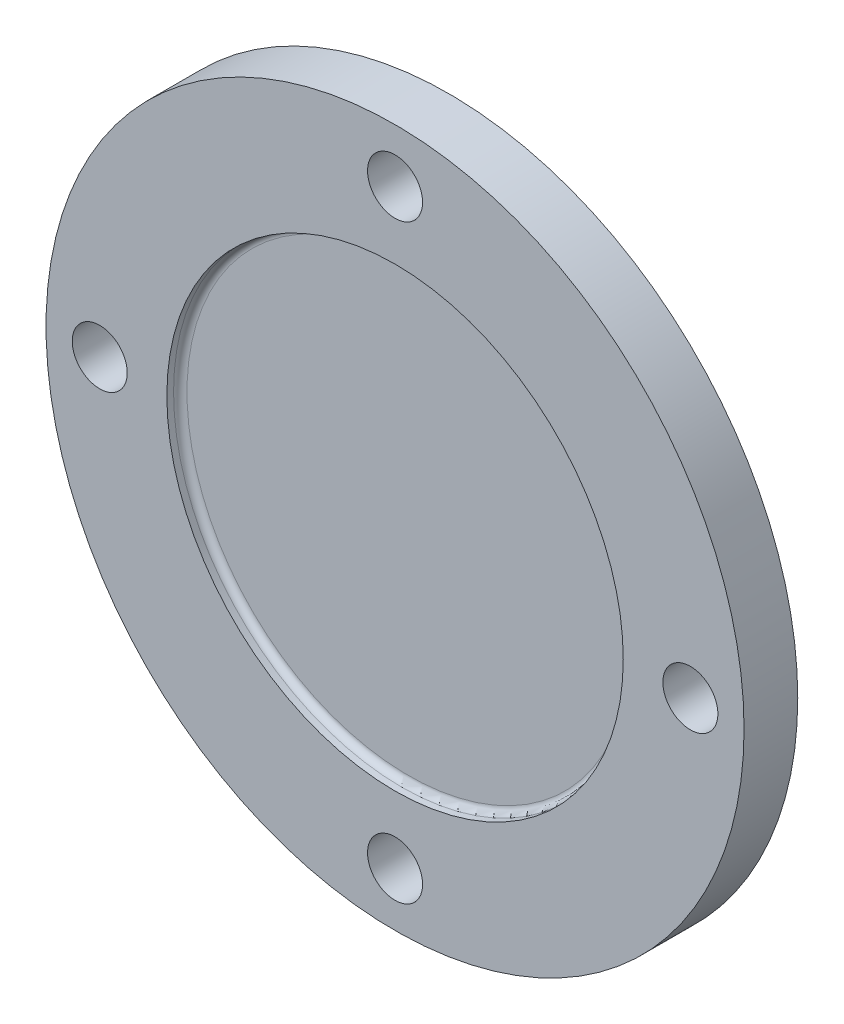
ISO-10303-21;
HEADER;
FILE_DESCRIPTION(('STEP AP214'),'2;1');
FILE_NAME('part.step','',(''),(''),'','','');
FILE_SCHEMA(('AUTOMOTIVE_DESIGN { 1 0 10303 214 1 1 1 1 }'));
ENDSEC;
DATA;
#1=APPLICATION_CONTEXT('core data for automotive mechanical design processes');
#2=APPLICATION_PROTOCOL_DEFINITION('international standard','automotive_design',2000,#1);
#3=PRODUCT_CONTEXT('',#1,'mechanical');
#4=PRODUCT('Part','Part','',(#3));
#5=PRODUCT_RELATED_PRODUCT_CATEGORY('part','',(#4));
#6=PRODUCT_DEFINITION_FORMATION('','',#4);
#7=PRODUCT_DEFINITION_CONTEXT('part definition',#1,'design');
#8=PRODUCT_DEFINITION('design','',#6,#7);
#9=PRODUCT_DEFINITION_SHAPE('','',#8);
#10=(LENGTH_UNIT() NAMED_UNIT(*) SI_UNIT(.MILLI.,.METRE.));
#11=(NAMED_UNIT(*) PLANE_ANGLE_UNIT() SI_UNIT($,.RADIAN.));
#12=(NAMED_UNIT(*) SI_UNIT($,.STERADIAN.) SOLID_ANGLE_UNIT());
#13=UNCERTAINTY_MEASURE_WITH_UNIT(LENGTH_MEASURE(1.E-05),#10,'distance_accuracy_value','');
#14=(GEOMETRIC_REPRESENTATION_CONTEXT(3) GLOBAL_UNCERTAINTY_ASSIGNED_CONTEXT((#13)) GLOBAL_UNIT_ASSIGNED_CONTEXT((#10,
#11,#12)) REPRESENTATION_CONTEXT('',''));
#15=CARTESIAN_POINT('',(0.,0.,0.));
#16=DIRECTION('',(0.,0.,1.));
#17=DIRECTION('',(1.,0.,0.));
#18=AXIS2_PLACEMENT_3D('',#15,#16,#17);
#19=CARTESIAN_POINT('',(0.,0.,8.));
#20=DIRECTION('',(0.,0.,1.));
#21=DIRECTION('',(1.,0.,0.));
#22=AXIS2_PLACEMENT_3D('',#19,#20,#21);
#23=PLANE('',#22);
#24=CARTESIAN_POINT('',(0.,0.,8.));
#25=DIRECTION('',(0.,0.,1.));
#26=DIRECTION('',(1.,0.,0.));
#27=AXIS2_PLACEMENT_3D('',#24,#25,#26);
#28=CIRCLE('',#27,34.);
#29=CARTESIAN_POINT('',(34.,0.,8.));
#30=VERTEX_POINT('',#29);
#31=EDGE_CURVE('E108',#30,#30,#28,.T.);
#32=ORIENTED_EDGE('',*,*,#31,.F.);
#33=EDGE_LOOP('',(#32));
#34=FACE_BOUND('',#33,.T.);
#35=CARTESIAN_POINT('',(-3.07250357818196E-13,-44.,8.));
#36=DIRECTION('',(0.,0.,1.));
#37=DIRECTION('',(1.,0.,0.));
#38=AXIS2_PLACEMENT_3D('',#35,#36,#37);
#39=CIRCLE('',#38,4.1);
#40=CARTESIAN_POINT('',(4.09999999999969,-44.,8.));
#41=VERTEX_POINT('',#40);
#42=EDGE_CURVE('E92',#41,#41,#39,.T.);
#43=ORIENTED_EDGE('',*,*,#42,.F.);
#44=EDGE_LOOP('',(#43));
#45=FACE_BOUND('',#44,.T.);
#46=CARTESIAN_POINT('',(0.,44.,8.));
#47=DIRECTION('',(0.,0.,1.));
#48=DIRECTION('',(1.,0.,0.));
#49=AXIS2_PLACEMENT_3D('',#46,#47,#48);
#50=CIRCLE('',#49,4.1);
#51=CARTESIAN_POINT('',(4.1,44.,8.));
#52=VERTEX_POINT('',#51);
#53=EDGE_CURVE('E76',#52,#52,#50,.T.);
#54=ORIENTED_EDGE('',*,*,#53,.F.);
#55=EDGE_LOOP('',(#54));
#56=FACE_BOUND('',#55,.T.);
#57=CARTESIAN_POINT('',(0.,0.,8.));
#58=DIRECTION('',(0.,0.,1.));
#59=DIRECTION('',(1.,0.,0.));
#60=AXIS2_PLACEMENT_3D('',#57,#58,#59);
#61=CIRCLE('',#60,52.);
#62=CARTESIAN_POINT('',(52.,0.,8.));
#63=VERTEX_POINT('',#62);
#64=EDGE_CURVE('E71',#63,#63,#61,.T.);
#65=ORIENTED_EDGE('',*,*,#64,.T.);
#66=EDGE_LOOP('',(#65));
#67=FACE_BOUND('',#66,.T.);
#68=CARTESIAN_POINT('',(44.,-1.53625178909098E-13,8.));
#69=DIRECTION('',(0.,0.,1.));
#70=DIRECTION('',(1.,0.,0.));
#71=AXIS2_PLACEMENT_3D('',#68,#69,#70);
#72=CIRCLE('',#71,4.1);
#73=CARTESIAN_POINT('',(48.1,-1.53625178909098E-13,8.));
#74=VERTEX_POINT('',#73);
#75=EDGE_CURVE('E84',#74,#74,#72,.T.);
#76=ORIENTED_EDGE('',*,*,#75,.F.);
#77=EDGE_LOOP('',(#76));
#78=FACE_BOUND('',#77,.T.);
#79=CARTESIAN_POINT('',(-44.,4.60875536727294E-13,8.));
#80=DIRECTION('',(0.,0.,1.));
#81=DIRECTION('',(1.,0.,0.));
#82=AXIS2_PLACEMENT_3D('',#79,#80,#81);
#83=CIRCLE('',#82,4.1);
#84=CARTESIAN_POINT('',(-39.9,4.60875536727294E-13,8.));
#85=VERTEX_POINT('',#84);
#86=EDGE_CURVE('E100',#85,#85,#83,.T.);
#87=ORIENTED_EDGE('',*,*,#86,.F.);
#88=EDGE_LOOP('',(#87));
#89=FACE_BOUND('',#88,.T.);
#90=ADVANCED_FACE('F43',(#34,#45,#56,#67,#78,#89),#23,.T.);
#91=CARTESIAN_POINT('',(0.,0.,0.));
#92=DIRECTION('',(0.,0.,1.));
#93=DIRECTION('',(1.,0.,0.));
#94=AXIS2_PLACEMENT_3D('',#91,#92,#93);
#95=PLANE('',#94);
#96=CARTESIAN_POINT('',(0.,0.,0.));
#97=DIRECTION('',(0.,0.,1.));
#98=DIRECTION('',(1.,0.,0.));
#99=AXIS2_PLACEMENT_3D('',#96,#97,#98);
#100=CIRCLE('',#99,34.);
#101=CARTESIAN_POINT('',(34.,0.,0.));
#102=VERTEX_POINT('',#101);
#103=EDGE_CURVE('E56',#102,#102,#100,.F.);
#104=ORIENTED_EDGE('',*,*,#103,.F.);
#105=EDGE_LOOP('',(#104));
#106=FACE_BOUND('',#105,.T.);
#107=CARTESIAN_POINT('',(0.,0.,0.));
#108=DIRECTION('',(0.,0.,1.));
#109=DIRECTION('',(1.,0.,0.));
#110=AXIS2_PLACEMENT_3D('',#107,#108,#109);
#111=CIRCLE('',#110,52.);
#112=CARTESIAN_POINT('',(52.,0.,0.));
#113=VERTEX_POINT('',#112);
#114=EDGE_CURVE('E72',#113,#113,#111,.T.);
#115=ORIENTED_EDGE('',*,*,#114,.F.);
#116=EDGE_LOOP('',(#115));
#117=FACE_BOUND('',#116,.T.);
#118=CARTESIAN_POINT('',(0.,44.,0.));
#119=DIRECTION('',(0.,0.,1.));
#120=DIRECTION('',(1.,0.,0.));
#121=AXIS2_PLACEMENT_3D('',#118,#119,#120);
#122=CIRCLE('',#121,4.1);
#123=CARTESIAN_POINT('',(4.1,44.,0.));
#124=VERTEX_POINT('',#123);
#125=EDGE_CURVE('E80',#124,#124,#122,.T.);
#126=ORIENTED_EDGE('',*,*,#125,.T.);
#127=EDGE_LOOP('',(#126));
#128=FACE_BOUND('',#127,.T.);
#129=CARTESIAN_POINT('',(44.,-1.53625178909098E-13,0.));
#130=DIRECTION('',(0.,0.,1.));
#131=DIRECTION('',(1.,0.,0.));
#132=AXIS2_PLACEMENT_3D('',#129,#130,#131);
#133=CIRCLE('',#132,4.1);
#134=CARTESIAN_POINT('',(48.1,-1.53625178909098E-13,0.));
#135=VERTEX_POINT('',#134);
#136=EDGE_CURVE('E88',#135,#135,#133,.T.);
#137=ORIENTED_EDGE('',*,*,#136,.T.);
#138=EDGE_LOOP('',(#137));
#139=FACE_BOUND('',#138,.T.);
#140=CARTESIAN_POINT('',(-3.07250357818196E-13,-44.,0.));
#141=DIRECTION('',(0.,0.,1.));
#142=DIRECTION('',(1.,0.,0.));
#143=AXIS2_PLACEMENT_3D('',#140,#141,#142);
#144=CIRCLE('',#143,4.1);
#145=CARTESIAN_POINT('',(4.09999999999969,-44.,0.));
#146=VERTEX_POINT('',#145);
#147=EDGE_CURVE('E96',#146,#146,#144,.T.);
#148=ORIENTED_EDGE('',*,*,#147,.T.);
#149=EDGE_LOOP('',(#148));
#150=FACE_BOUND('',#149,.T.);
#151=CARTESIAN_POINT('',(-44.,4.60875536727294E-13,0.));
#152=DIRECTION('',(0.,0.,1.));
#153=DIRECTION('',(1.,0.,0.));
#154=AXIS2_PLACEMENT_3D('',#151,#152,#153);
#155=CIRCLE('',#154,4.1);
#156=CARTESIAN_POINT('',(-39.9,4.60875536727294E-13,0.));
#157=VERTEX_POINT('',#156);
#158=EDGE_CURVE('E104',#157,#157,#155,.T.);
#159=ORIENTED_EDGE('',*,*,#158,.T.);
#160=EDGE_LOOP('',(#159));
#161=FACE_BOUND('',#160,.T.);
#162=ADVANCED_FACE('F143',(#106,#117,#128,#139,#150,#161),#95,.F.);
#163=CARTESIAN_POINT('',(0.,0.,8.));
#164=DIRECTION('',(0.,0.,-1.));
#165=DIRECTION('',(-1.,0.,0.));
#166=AXIS2_PLACEMENT_3D('',#163,#164,#165);
#167=CYLINDRICAL_SURFACE('',#166,52.);
#168=ORIENTED_EDGE('',*,*,#64,.F.);
#169=EDGE_LOOP('',(#168));
#170=FACE_BOUND('',#169,.T.);
#171=ORIENTED_EDGE('',*,*,#114,.T.);
#172=EDGE_LOOP('',(#171));
#173=FACE_BOUND('',#172,.T.);
#174=ADVANCED_FACE('F150',(#170,#173),#167,.T.);
#175=CARTESIAN_POINT('',(0.,44.,8.));
#176=DIRECTION('',(0.,0.,-1.));
#177=DIRECTION('',(-1.,0.,0.));
#178=AXIS2_PLACEMENT_3D('',#175,#176,#177);
#179=CYLINDRICAL_SURFACE('',#178,4.1);
#180=ORIENTED_EDGE('',*,*,#53,.T.);
#181=EDGE_LOOP('',(#180));
#182=FACE_BOUND('',#181,.T.);
#183=ORIENTED_EDGE('',*,*,#125,.F.);
#184=EDGE_LOOP('',(#183));
#185=FACE_BOUND('',#184,.T.);
#186=ADVANCED_FACE('F157',(#182,#185),#179,.F.);
#187=CARTESIAN_POINT('',(44.,-1.53625178909098E-13,8.));
#188=DIRECTION('',(0.,0.,-1.));
#189=DIRECTION('',(-1.,0.,0.));
#190=AXIS2_PLACEMENT_3D('',#187,#188,#189);
#191=CYLINDRICAL_SURFACE('',#190,4.1);
#192=ORIENTED_EDGE('',*,*,#75,.T.);
#193=EDGE_LOOP('',(#192));
#194=FACE_BOUND('',#193,.T.);
#195=ORIENTED_EDGE('',*,*,#136,.F.);
#196=EDGE_LOOP('',(#195));
#197=FACE_BOUND('',#196,.T.);
#198=ADVANCED_FACE('F165',(#194,#197),#191,.F.);
#199=CARTESIAN_POINT('',(-3.07250357818196E-13,-44.,8.));
#200=DIRECTION('',(0.,0.,-1.));
#201=DIRECTION('',(-1.,0.,0.));
#202=AXIS2_PLACEMENT_3D('',#199,#200,#201);
#203=CYLINDRICAL_SURFACE('',#202,4.1);
#204=ORIENTED_EDGE('',*,*,#42,.T.);
#205=EDGE_LOOP('',(#204));
#206=FACE_BOUND('',#205,.T.);
#207=ORIENTED_EDGE('',*,*,#147,.F.);
#208=EDGE_LOOP('',(#207));
#209=FACE_BOUND('',#208,.T.);
#210=ADVANCED_FACE('F182',(#206,#209),#203,.F.);
#211=CARTESIAN_POINT('',(-44.,4.60875536727294E-13,8.));
#212=DIRECTION('',(0.,0.,-1.));
#213=DIRECTION('',(-1.,0.,0.));
#214=AXIS2_PLACEMENT_3D('',#211,#212,#213);
#215=CYLINDRICAL_SURFACE('',#214,4.1);
#216=ORIENTED_EDGE('',*,*,#86,.T.);
#217=EDGE_LOOP('',(#216));
#218=FACE_BOUND('',#217,.T.);
#219=ORIENTED_EDGE('',*,*,#158,.F.);
#220=EDGE_LOOP('',(#219));
#221=FACE_BOUND('',#220,.T.);
#222=ADVANCED_FACE('F180',(#218,#221),#215,.F.);
#223=CARTESIAN_POINT('',(0.,0.,6.));
#224=DIRECTION('',(0.,0.,1.));
#225=DIRECTION('',(1.,0.,0.));
#226=AXIS2_PLACEMENT_3D('',#223,#224,#225);
#227=CYLINDRICAL_SURFACE('',#226,34.);
#228=CARTESIAN_POINT('',(0.,0.,7.));
#229=DIRECTION('',(0.,0.,1.));
#230=DIRECTION('',(1.,0.,0.));
#231=AXIS2_PLACEMENT_3D('',#228,#229,#230);
#232=CIRCLE('',#231,34.);
#233=CARTESIAN_POINT('',(34.,0.,7.));
#234=VERTEX_POINT('',#233);
#235=EDGE_CURVE('E61',#234,#234,#232,.F.);
#236=ORIENTED_EDGE('',*,*,#235,.T.);
#237=EDGE_LOOP('',(#236));
#238=FACE_BOUND('',#237,.T.);
#239=ORIENTED_EDGE('',*,*,#31,.T.);
#240=EDGE_LOOP('',(#239));
#241=FACE_BOUND('',#240,.T.);
#242=ADVANCED_FACE('F181',(#238,#241),#227,.F.);
#243=CARTESIAN_POINT('',(0.,0.,6.));
#244=DIRECTION('',(0.,0.,1.));
#245=DIRECTION('',(1.,0.,0.));
#246=AXIS2_PLACEMENT_3D('',#243,#244,#245);
#247=PLANE('',#246);
#248=CARTESIAN_POINT('',(0.,0.,6.));
#249=DIRECTION('',(0.,0.,1.));
#250=DIRECTION('',(1.,0.,0.));
#251=AXIS2_PLACEMENT_3D('',#248,#249,#250);
#252=CIRCLE('',#251,33.);
#253=CARTESIAN_POINT('',(33.,0.,6.));
#254=VERTEX_POINT('',#253);
#255=EDGE_CURVE('E67',#254,#254,#252,.T.);
#256=ORIENTED_EDGE('',*,*,#255,.T.);
#257=EDGE_LOOP('',(#256));
#258=FACE_BOUND('',#257,.T.);
#259=ADVANCED_FACE('F139',(#258),#247,.T.);
#260=CARTESIAN_POINT('',(0.,0.,7.));
#261=DIRECTION('',(0.,0.,1.));
#262=DIRECTION('',(1.,0.,0.));
#263=AXIS2_PLACEMENT_3D('',#260,#261,#262);
#264=TOROIDAL_SURFACE('',#263,33.,1.);
#265=ORIENTED_EDGE('',*,*,#235,.F.);
#266=EDGE_LOOP('',(#265));
#267=FACE_BOUND('',#266,.T.);
#268=ORIENTED_EDGE('',*,*,#255,.F.);
#269=EDGE_LOOP('',(#268));
#270=FACE_BOUND('',#269,.T.);
#271=ADVANCED_FACE('F129',(#267,#270),#264,.F.);
#272=CARTESIAN_POINT('',(0.,0.,-11.3));
#273=DIRECTION('',(0.,0.,-1.));
#274=DIRECTION('',(-1.,0.,0.));
#275=AXIS2_PLACEMENT_3D('',#272,#273,#274);
#276=PLANE('',#275);
#277=CARTESIAN_POINT('',(0.,0.,-11.3));
#278=DIRECTION('',(0.,0.,-1.));
#279=DIRECTION('',(-1.,0.,0.));
#280=AXIS2_PLACEMENT_3D('',#277,#278,#279);
#281=CIRCLE('',#280,34.);
#282=CARTESIAN_POINT('',(-34.,0.,-11.3));
#283=VERTEX_POINT('',#282);
#284=EDGE_CURVE('E115',#283,#283,#281,.T.);
#285=ORIENTED_EDGE('',*,*,#284,.T.);
#286=EDGE_LOOP('',(#285));
#287=FACE_BOUND('',#286,.T.);
#288=CARTESIAN_POINT('',(0.,0.,-11.3));
#289=DIRECTION('',(0.,0.,-1.));
#290=DIRECTION('',(-1.,0.,0.));
#291=AXIS2_PLACEMENT_3D('',#288,#289,#290);
#292=CIRCLE('',#291,25.);
#293=CARTESIAN_POINT('',(-25.,0.,-11.3));
#294=VERTEX_POINT('',#293);
#295=EDGE_CURVE('E119',#294,#294,#292,.T.);
#296=ORIENTED_EDGE('',*,*,#295,.F.);
#297=EDGE_LOOP('',(#296));
#298=FACE_BOUND('',#297,.T.);
#299=ADVANCED_FACE('F126',(#287,#298),#276,.T.);
#300=CARTESIAN_POINT('',(0.,0.,-11.3));
#301=DIRECTION('',(0.,0.,1.));
#302=DIRECTION('',(1.,0.,0.));
#303=AXIS2_PLACEMENT_3D('',#300,#301,#302);
#304=CYLINDRICAL_SURFACE('',#303,34.);
#305=ORIENTED_EDGE('',*,*,#284,.F.);
#306=EDGE_LOOP('',(#305));
#307=FACE_BOUND('',#306,.T.);
#308=ORIENTED_EDGE('',*,*,#103,.T.);
#309=EDGE_LOOP('',(#308));
#310=FACE_BOUND('',#309,.T.);
#311=ADVANCED_FACE('F128',(#307,#310),#304,.T.);
#312=CARTESIAN_POINT('',(0.,0.,-11.3));
#313=DIRECTION('',(0.,0.,1.));
#314=DIRECTION('',(1.,0.,0.));
#315=AXIS2_PLACEMENT_3D('',#312,#313,#314);
#316=CYLINDRICAL_SURFACE('',#315,25.);
#317=CARTESIAN_POINT('',(0.,0.,-6.));
#318=DIRECTION('',(0.,0.,1.));
#319=DIRECTION('',(1.,0.,0.));
#320=AXIS2_PLACEMENT_3D('',#317,#318,#319);
#321=CIRCLE('',#320,25.);
#322=CARTESIAN_POINT('',(25.,0.,-6.));
#323=VERTEX_POINT('',#322);
#324=EDGE_CURVE('E10',#323,#323,#321,.T.);
#325=ORIENTED_EDGE('',*,*,#324,.T.);
#326=EDGE_LOOP('',(#325));
#327=FACE_BOUND('',#326,.T.);
#328=ORIENTED_EDGE('',*,*,#295,.T.);
#329=EDGE_LOOP('',(#328));
#330=FACE_BOUND('',#329,.T.);
#331=ADVANCED_FACE('F124',(#327,#330),#316,.F.);
#332=CARTESIAN_POINT('',(0.,0.,0.));
#333=DIRECTION('',(0.,0.,1.));
#334=DIRECTION('',(1.,0.,0.));
#335=AXIS2_PLACEMENT_3D('',#332,#333,#334);
#336=CIRCLE('',#335,19.);
#337=CARTESIAN_POINT('',(19.,0.,0.));
#338=VERTEX_POINT('',#337);
#339=EDGE_CURVE('E51',#338,#338,#336,.F.);
#340=ORIENTED_EDGE('',*,*,#339,.T.);
#341=EDGE_LOOP('',(#340));
#342=FACE_BOUND('',#341,.T.);
#343=ADVANCED_FACE('F153',(#342),#95,.F.);
#344=CARTESIAN_POINT('',(0.,0.,-6.));
#345=DIRECTION('',(0.,0.,1.));
#346=DIRECTION('',(1.,0.,0.));
#347=AXIS2_PLACEMENT_3D('',#344,#345,#346);
#348=TOROIDAL_SURFACE('',#347,19.,6.);
#349=ORIENTED_EDGE('',*,*,#324,.F.);
#350=EDGE_LOOP('',(#349));
#351=FACE_BOUND('',#350,.T.);
#352=ORIENTED_EDGE('',*,*,#339,.F.);
#353=EDGE_LOOP('',(#352));
#354=FACE_BOUND('',#353,.T.);
#355=ADVANCED_FACE('F45',(#351,#354),#348,.F.);
#356=CLOSED_SHELL('',(#90,#162,#174,#186,#198,#210,#222,#242,#259,#271,#299,#311,#331,#343,#355));
#357=MANIFOLD_SOLID_BREP('B2',#356);
#358=ADVANCED_BREP_SHAPE_REPRESENTATION('',(#18,#357),#14);
#359=SHAPE_DEFINITION_REPRESENTATION(#9,#358);
ENDSEC;
END-ISO-10303-21;
